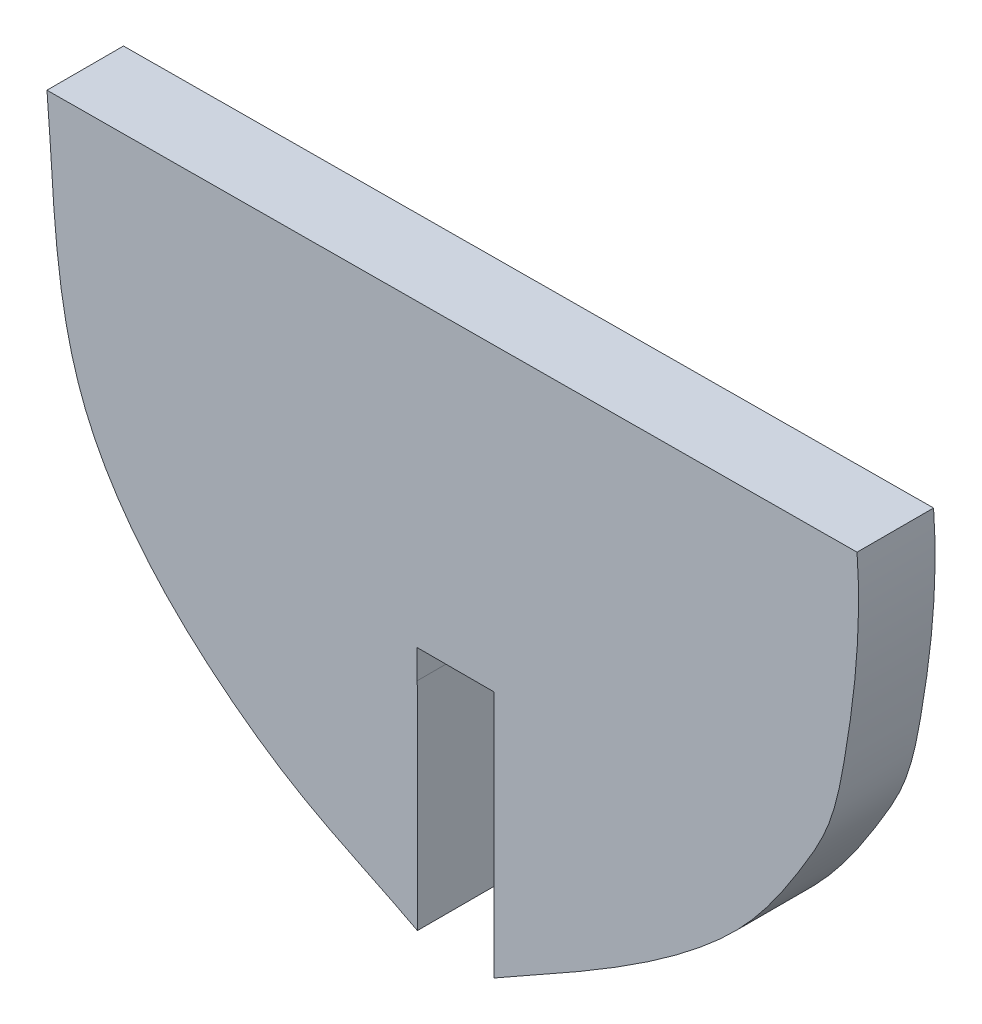
ISO-10303-21;
HEADER;
FILE_DESCRIPTION(('STEP AP214'),'2;1');
FILE_NAME('part.step','',(''),(''),'','','');
FILE_SCHEMA(('AUTOMOTIVE_DESIGN { 1 0 10303 214 1 1 1 1 }'));
ENDSEC;
DATA;
#1=APPLICATION_CONTEXT('core data for automotive mechanical design processes');
#2=APPLICATION_PROTOCOL_DEFINITION('international standard','automotive_design',2000,#1);
#3=PRODUCT_CONTEXT('',#1,'mechanical');
#4=PRODUCT('Part','Part','',(#3));
#5=PRODUCT_RELATED_PRODUCT_CATEGORY('part','',(#4));
#6=PRODUCT_DEFINITION_FORMATION('','',#4);
#7=PRODUCT_DEFINITION_CONTEXT('part definition',#1,'design');
#8=PRODUCT_DEFINITION('design','',#6,#7);
#9=PRODUCT_DEFINITION_SHAPE('','',#8);
#10=(LENGTH_UNIT() NAMED_UNIT(*) SI_UNIT(.MILLI.,.METRE.));
#11=(NAMED_UNIT(*) PLANE_ANGLE_UNIT() SI_UNIT($,.RADIAN.));
#12=(NAMED_UNIT(*) SI_UNIT($,.STERADIAN.) SOLID_ANGLE_UNIT());
#13=UNCERTAINTY_MEASURE_WITH_UNIT(LENGTH_MEASURE(1.E-05),#10,'distance_accuracy_value','');
#14=(GEOMETRIC_REPRESENTATION_CONTEXT(3) GLOBAL_UNCERTAINTY_ASSIGNED_CONTEXT((#13)) GLOBAL_UNIT_ASSIGNED_CONTEXT((#10,
#11,#12)) REPRESENTATION_CONTEXT('',''));
#15=CARTESIAN_POINT('',(0.,0.,0.));
#16=DIRECTION('',(0.,0.,1.));
#17=DIRECTION('',(1.,0.,0.));
#18=AXIS2_PLACEMENT_3D('',#15,#16,#17);
#19=CARTESIAN_POINT('',(9.88414062672051,48.8909674775734,8.));
#20=CARTESIAN_POINT('',(16.7973690641782,52.799383097225,8.));
#21=CARTESIAN_POINT('',(26.48644029243,57.9325721098156,8.));
#22=CARTESIAN_POINT('',(37.0877787236322,67.3102232404793,8.));
#23=CARTESIAN_POINT('',(41.4970740547295,73.9277841349604,8.));
#24=CARTESIAN_POINT('',(45.2673294927324,80.3524661797227,8.));
#25=CARTESIAN_POINT('',(47.3704632870748,91.0399032929968,8.));
#26=CARTESIAN_POINT('',(48.3194732407967,99.8690349474082,8.));
#27=CARTESIAN_POINT('',(47.8336606975591,106.415821200758,8.));
#28=B_SPLINE_CURVE_WITH_KNOTS('',3,(#19,#20,#21,#22,#23,#24,#25,#26,#27),.UNSPECIFIED.,.F.,.F.,
(4,1,1,1,1,1,4),(0.,0.321011787333116,0.439212967345733,0.56589062417626,0.640324830786766,
0.737429993102892,1.),.UNSPECIFIED.);
#29=DIRECTION('',(0.,0.,-1.));
#30=VECTOR('',#29,1.);
#31=SURFACE_OF_LINEAR_EXTRUSION('',#28,#30);
#32=CARTESIAN_POINT('',(9.88414062672051,48.8909674775734,0.));
#33=CARTESIAN_POINT('',(16.7973690641782,52.799383097225,0.));
#34=CARTESIAN_POINT('',(26.48644029243,57.9325721098156,0.));
#35=CARTESIAN_POINT('',(37.0877787236322,67.3102232404793,0.));
#36=CARTESIAN_POINT('',(41.4970740547295,73.9277841349604,0.));
#37=CARTESIAN_POINT('',(45.2673294927324,80.3524661797227,0.));
#38=CARTESIAN_POINT('',(47.3704632870748,91.0399032929968,0.));
#39=CARTESIAN_POINT('',(48.3194732407967,99.8690349474082,0.));
#40=CARTESIAN_POINT('',(47.8336606975591,106.415821200758,0.));
#41=B_SPLINE_CURVE_WITH_KNOTS('',3,(#32,#33,#34,#35,#36,#37,#38,#39,#40),.UNSPECIFIED.,.F.,.F.,
(4,1,1,1,1,1,4),(0.,0.321011787333116,0.439212967345733,0.56589062417626,0.640324830786766,
0.737429993102892,1.),.UNSPECIFIED.);
#42=CARTESIAN_POINT('',(9.88414062672051,48.8909674775734,0.));
#43=VERTEX_POINT('',#42);
#44=CARTESIAN_POINT('',(47.8336606975591,106.415821200758,0.));
#45=VERTEX_POINT('',#44);
#46=EDGE_CURVE('E138',#43,#45,#41,.T.);
#47=ORIENTED_EDGE('',*,*,#46,.T.);
#48=DIRECTION('',(0.,0.,-1.));
#49=VECTOR('',#48,1.);
#50=CARTESIAN_POINT('',(47.8336606975591,106.415821200758,8.));
#51=LINE('',#50,#49);
#52=CARTESIAN_POINT('',(47.8336606975591,106.415821200758,8.));
#53=VERTEX_POINT('',#52);
#54=EDGE_CURVE('E11',#53,#45,#51,.T.);
#55=ORIENTED_EDGE('',*,*,#54,.F.);
#56=CARTESIAN_POINT('',(9.88414062672051,48.8909674775734,8.));
#57=VERTEX_POINT('',#56);
#58=EDGE_CURVE('E162',#57,#53,#28,.T.);
#59=ORIENTED_EDGE('',*,*,#58,.F.);
#60=DIRECTION('',(0.,0.,-1.));
#61=VECTOR('',#60,1.);
#62=CARTESIAN_POINT('',(9.88414062672051,48.8909674775734,8.));
#63=LINE('',#62,#61);
#64=EDGE_CURVE('E134',#57,#43,#63,.T.);
#65=ORIENTED_EDGE('',*,*,#64,.T.);
#66=EDGE_LOOP('',(#47,#55,#59,#65));
#67=FACE_BOUND('',#66,.T.);
#68=ADVANCED_FACE('F41',(#67),#31,.F.);
#69=CARTESIAN_POINT('',(47.8336606975591,106.415821200758,8.));
#70=DIRECTION('',(0.00610299078543812,-0.999981376578321,0.));
#71=DIRECTION('',(0.999981376578321,0.00610299078543812,0.));
#72=AXIS2_PLACEMENT_3D('',#69,#70,#71);
#73=PLANE('',#72);
#74=DIRECTION('',(-0.99998137657832,-0.00610299078543812,0.));
#75=VECTOR('',#74,1.);
#76=CARTESIAN_POINT('',(47.8336606975591,106.415821200758,0.));
#77=LINE('',#76,#75);
#78=CARTESIAN_POINT('',(-36.847635358491,105.899002406295,0.));
#79=VERTEX_POINT('',#78);
#80=EDGE_CURVE('E143',#45,#79,#77,.T.);
#81=ORIENTED_EDGE('',*,*,#80,.T.);
#82=DIRECTION('',(0.,0.,-1.));
#83=VECTOR('',#82,1.);
#84=CARTESIAN_POINT('',(-36.847635358491,105.899002406295,8.));
#85=LINE('',#84,#83);
#86=CARTESIAN_POINT('',(-36.847635358491,105.899002406295,8.));
#87=VERTEX_POINT('',#86);
#88=EDGE_CURVE('E50',#87,#79,#85,.T.);
#89=ORIENTED_EDGE('',*,*,#88,.F.);
#90=DIRECTION('',(-0.99998137657832,-0.00610299078543812,0.));
#91=VECTOR('',#90,1.);
#92=CARTESIAN_POINT('',(47.8336606975591,106.415821200758,8.));
#93=LINE('',#92,#91);
#94=EDGE_CURVE('E101',#53,#87,#93,.T.);
#95=ORIENTED_EDGE('',*,*,#94,.F.);
#96=ORIENTED_EDGE('',*,*,#54,.T.);
#97=EDGE_LOOP('',(#81,#89,#95,#96));
#98=FACE_BOUND('',#97,.T.);
#99=ADVANCED_FACE('F202',(#98),#73,.F.);
#100=CARTESIAN_POINT('',(-36.847635358491,105.899002406295,8.));
#101=CARTESIAN_POINT('',(-36.0664858060786,97.042827625946,8.));
#102=CARTESIAN_POINT('',(-36.3372086802923,82.7405401159872,8.));
#103=CARTESIAN_POINT('',(-26.7565430099379,68.3679408590675,8.));
#104=CARTESIAN_POINT('',(-18.6844662464954,60.9206869290169,8.));
#105=CARTESIAN_POINT('',(-9.36862053910992,54.4058899599076,8.));
#106=CARTESIAN_POINT('',(-2.14754352514569,51.3201035411095,8.));
#107=CARTESIAN_POINT('',(1.88060929933309,49.1820213592139,8.));
#108=B_SPLINE_CURVE_WITH_KNOTS('',3,(#100,#101,#102,#103,#104,#105,#106,#107),.UNSPECIFIED.,.F.,
.F.,(4,1,1,1,1,4),(0.,0.370942891565251,0.541599443098624,0.683371746995421,0.815067179970168,
1.),.UNSPECIFIED.);
#109=DIRECTION('',(0.,0.,-1.));
#110=VECTOR('',#109,1.);
#111=SURFACE_OF_LINEAR_EXTRUSION('',#108,#110);
#112=CARTESIAN_POINT('',(-36.847635358491,105.899002406295,0.));
#113=CARTESIAN_POINT('',(-36.0664858060786,97.042827625946,0.));
#114=CARTESIAN_POINT('',(-36.3372086802923,82.7405401159872,0.));
#115=CARTESIAN_POINT('',(-26.7565430099379,68.3679408590675,0.));
#116=CARTESIAN_POINT('',(-18.6844662464954,60.9206869290169,0.));
#117=CARTESIAN_POINT('',(-9.36862053910992,54.4058899599076,0.));
#118=CARTESIAN_POINT('',(-2.14754352514569,51.3201035411095,0.));
#119=CARTESIAN_POINT('',(1.88060929933309,49.1820213592139,0.));
#120=B_SPLINE_CURVE_WITH_KNOTS('',3,(#112,#113,#114,#115,#116,#117,#118,#119),.UNSPECIFIED.,.F.,
.F.,(4,1,1,1,1,4),(0.,0.370942891565251,0.541599443098624,0.683371746995421,0.815067179970168,
1.),.UNSPECIFIED.);
#121=CARTESIAN_POINT('',(1.88060929933309,49.1820213592139,0.));
#122=VERTEX_POINT('',#121);
#123=EDGE_CURVE('E148',#79,#122,#120,.T.);
#124=ORIENTED_EDGE('',*,*,#123,.T.);
#125=DIRECTION('',(0.,0.,-1.));
#126=VECTOR('',#125,1.);
#127=CARTESIAN_POINT('',(1.88060929933309,49.1820213592139,8.));
#128=LINE('',#127,#126);
#129=CARTESIAN_POINT('',(1.88060929933309,49.1820213592139,8.));
#130=VERTEX_POINT('',#129);
#131=EDGE_CURVE('E169',#130,#122,#128,.T.);
#132=ORIENTED_EDGE('',*,*,#131,.F.);
#133=EDGE_CURVE('E177',#87,#130,#108,.T.);
#134=ORIENTED_EDGE('',*,*,#133,.F.);
#135=ORIENTED_EDGE('',*,*,#88,.T.);
#136=EDGE_LOOP('',(#124,#132,#134,#135));
#137=FACE_BOUND('',#136,.T.);
#138=ADVANCED_FACE('F175',(#137),#111,.F.);
#139=CARTESIAN_POINT('',(1.85934215758753,71.7896389053083,8.));
#140=DIRECTION('',(-0.999999557535561,-0.000940706480558737,0.));
#141=DIRECTION('',(0.000940706480558737,-0.999999557535561,0.));
#142=AXIS2_PLACEMENT_3D('',#139,#140,#141);
#143=PLANE('',#142);
#144=DIRECTION('',(-0.000940706480558737,0.999999557535561,0.));
#145=VECTOR('',#144,1.);
#146=CARTESIAN_POINT('',(1.85934215758753,71.7896389053083,0.));
#147=LINE('',#146,#145);
#148=CARTESIAN_POINT('',(1.85934215758753,71.7896389053083,0.));
#149=VERTEX_POINT('',#148);
#150=EDGE_CURVE('E152',#122,#149,#147,.T.);
#151=ORIENTED_EDGE('',*,*,#150,.T.);
#152=DIRECTION('',(0.,0.,-1.));
#153=VECTOR('',#152,1.);
#154=CARTESIAN_POINT('',(1.85934215758753,71.7896389053083,8.));
#155=LINE('',#154,#153);
#156=CARTESIAN_POINT('',(1.85934215758753,71.7896389053083,8.));
#157=VERTEX_POINT('',#156);
#158=EDGE_CURVE('E166',#157,#149,#155,.T.);
#159=ORIENTED_EDGE('',*,*,#158,.F.);
#160=DIRECTION('',(-0.000940706480558737,0.999999557535561,0.));
#161=VECTOR('',#160,1.);
#162=CARTESIAN_POINT('',(1.85934215758753,71.7896389053083,8.));
#163=LINE('',#162,#161);
#164=EDGE_CURVE('E189',#130,#157,#163,.T.);
#165=ORIENTED_EDGE('',*,*,#164,.F.);
#166=ORIENTED_EDGE('',*,*,#131,.T.);
#167=EDGE_LOOP('',(#151,#159,#165,#166));
#168=FACE_BOUND('',#167,.T.);
#169=ADVANCED_FACE('F185',(#168),#143,.F.);
#170=CARTESIAN_POINT('',(1.85934215758753,71.7896389053083,8.));
#171=DIRECTION('',(-1.,0.,0.));
#172=DIRECTION('',(0.,0.,1.));
#173=AXIS2_PLACEMENT_3D('',#170,#171,#172);
#174=PLANE('',#173);
#175=DIRECTION('',(0.,1.,0.));
#176=VECTOR('',#175,1.);
#177=CARTESIAN_POINT('',(1.85934215758753,71.7896389053083,0.));
#178=LINE('',#177,#176);
#179=CARTESIAN_POINT('',(1.85934215758753,74.7896389053083,0.));
#180=VERTEX_POINT('',#179);
#181=EDGE_CURVE('E157',#149,#180,#178,.T.);
#182=ORIENTED_EDGE('',*,*,#181,.T.);
#183=DIRECTION('',(0.,0.,-1.));
#184=VECTOR('',#183,1.);
#185=CARTESIAN_POINT('',(1.85934215758753,74.7896389053083,8.));
#186=LINE('',#185,#184);
#187=CARTESIAN_POINT('',(1.85934215758753,74.7896389053083,8.));
#188=VERTEX_POINT('',#187);
#189=EDGE_CURVE('E129',#188,#180,#186,.T.);
#190=ORIENTED_EDGE('',*,*,#189,.F.);
#191=DIRECTION('',(0.,1.,0.));
#192=VECTOR('',#191,1.);
#193=CARTESIAN_POINT('',(1.85934215758753,71.7896389053083,8.));
#194=LINE('',#193,#192);
#195=EDGE_CURVE('E120',#157,#188,#194,.T.);
#196=ORIENTED_EDGE('',*,*,#195,.F.);
#197=ORIENTED_EDGE('',*,*,#158,.T.);
#198=EDGE_LOOP('',(#182,#190,#196,#197));
#199=FACE_BOUND('',#198,.T.);
#200=ADVANCED_FACE('F188',(#199),#174,.F.);
#201=CARTESIAN_POINT('',(9.86259260626901,74.7896389053083,8.));
#202=DIRECTION('',(0.,1.,0.));
#203=DIRECTION('',(0.,0.,1.));
#204=AXIS2_PLACEMENT_3D('',#201,#202,#203);
#205=PLANE('',#204);
#206=DIRECTION('',(1.,0.,0.));
#207=VECTOR('',#206,1.);
#208=CARTESIAN_POINT('',(9.86259260626901,74.7896389053083,0.));
#209=LINE('',#208,#207);
#210=CARTESIAN_POINT('',(9.86259260626901,74.7896389053083,0.));
#211=VERTEX_POINT('',#210);
#212=EDGE_CURVE('E128',#180,#211,#209,.T.);
#213=ORIENTED_EDGE('',*,*,#212,.T.);
#214=DIRECTION('',(0.,0.,-1.));
#215=VECTOR('',#214,1.);
#216=CARTESIAN_POINT('',(9.86259260626901,74.7896389053083,8.));
#217=LINE('',#216,#215);
#218=CARTESIAN_POINT('',(9.86259260626901,74.7896389053083,8.));
#219=VERTEX_POINT('',#218);
#220=EDGE_CURVE('E125',#219,#211,#217,.T.);
#221=ORIENTED_EDGE('',*,*,#220,.F.);
#222=DIRECTION('',(1.,0.,0.));
#223=VECTOR('',#222,1.);
#224=CARTESIAN_POINT('',(9.86259260626901,74.7896389053083,8.));
#225=LINE('',#224,#223);
#226=EDGE_CURVE('E114',#188,#219,#225,.T.);
#227=ORIENTED_EDGE('',*,*,#226,.F.);
#228=ORIENTED_EDGE('',*,*,#189,.T.);
#229=EDGE_LOOP('',(#213,#221,#227,#228));
#230=FACE_BOUND('',#229,.T.);
#231=ADVANCED_FACE('F126',(#230),#205,.F.);
#232=CARTESIAN_POINT('',(9.86259260626901,71.7971676182021,8.));
#233=DIRECTION('',(1.,0.,0.));
#234=DIRECTION('',(0.,0.,-1.));
#235=AXIS2_PLACEMENT_3D('',#232,#233,#234);
#236=PLANE('',#235);
#237=DIRECTION('',(0.,-1.,0.));
#238=VECTOR('',#237,1.);
#239=CARTESIAN_POINT('',(9.86259260626901,71.7971676182021,0.));
#240=LINE('',#239,#238);
#241=CARTESIAN_POINT('',(9.86259260626901,71.7971676182021,0.));
#242=VERTEX_POINT('',#241);
#243=EDGE_CURVE('E87',#211,#242,#240,.T.);
#244=ORIENTED_EDGE('',*,*,#243,.T.);
#245=DIRECTION('',(0.,0.,-1.));
#246=VECTOR('',#245,1.);
#247=CARTESIAN_POINT('',(9.86259260626901,71.7971676182021,8.));
#248=LINE('',#247,#246);
#249=CARTESIAN_POINT('',(9.86259260626901,71.7971676182021,8.));
#250=VERTEX_POINT('',#249);
#251=EDGE_CURVE('E130',#250,#242,#248,.T.);
#252=ORIENTED_EDGE('',*,*,#251,.F.);
#253=DIRECTION('',(0.,-1.,0.));
#254=VECTOR('',#253,1.);
#255=CARTESIAN_POINT('',(9.86259260626901,71.7971676182021,8.));
#256=LINE('',#255,#254);
#257=EDGE_CURVE('E118',#219,#250,#256,.T.);
#258=ORIENTED_EDGE('',*,*,#257,.F.);
#259=ORIENTED_EDGE('',*,*,#220,.T.);
#260=EDGE_LOOP('',(#244,#252,#258,#259));
#261=FACE_BOUND('',#260,.T.);
#262=ADVANCED_FACE('F132',(#261),#236,.F.);
#263=CARTESIAN_POINT('',(9.88414062672051,48.8909674775734,8.));
#264=DIRECTION('',(0.999999557535561,0.000940706480558823,0.));
#265=DIRECTION('',(-0.000940706480558823,0.999999557535561,0.));
#266=AXIS2_PLACEMENT_3D('',#263,#264,#265);
#267=PLANE('',#266);
#268=DIRECTION('',(0.000940706480558823,-0.999999557535561,0.));
#269=VECTOR('',#268,1.);
#270=CARTESIAN_POINT('',(9.88414062672051,48.8909674775734,0.));
#271=LINE('',#270,#269);
#272=EDGE_CURVE('E93',#242,#43,#271,.T.);
#273=ORIENTED_EDGE('',*,*,#272,.T.);
#274=ORIENTED_EDGE('',*,*,#64,.F.);
#275=DIRECTION('',(0.000940706480558823,-0.999999557535561,0.));
#276=VECTOR('',#275,1.);
#277=CARTESIAN_POINT('',(9.88414062672051,48.8909674775734,8.));
#278=LINE('',#277,#276);
#279=EDGE_CURVE('E58',#250,#57,#278,.T.);
#280=ORIENTED_EDGE('',*,*,#279,.F.);
#281=ORIENTED_EDGE('',*,*,#251,.T.);
#282=EDGE_LOOP('',(#273,#274,#280,#281));
#283=FACE_BOUND('',#282,.T.);
#284=ADVANCED_FACE('F211',(#283),#267,.F.);
#285=CARTESIAN_POINT('',(39.4331978088349,70.9593925452252,8.));
#286=DIRECTION('',(0.,0.,1.));
#287=DIRECTION('',(1.,0.,0.));
#288=AXIS2_PLACEMENT_3D('',#285,#286,#287);
#289=PLANE('',#288);
#290=ORIENTED_EDGE('',*,*,#58,.T.);
#291=ORIENTED_EDGE('',*,*,#94,.T.);
#292=ORIENTED_EDGE('',*,*,#133,.T.);
#293=ORIENTED_EDGE('',*,*,#164,.T.);
#294=ORIENTED_EDGE('',*,*,#195,.T.);
#295=ORIENTED_EDGE('',*,*,#226,.T.);
#296=ORIENTED_EDGE('',*,*,#257,.T.);
#297=ORIENTED_EDGE('',*,*,#279,.T.);
#298=EDGE_LOOP('',(#290,#291,#292,#293,#294,#295,#296,#297));
#299=FACE_BOUND('',#298,.T.);
#300=ADVANCED_FACE('F116',(#299),#289,.T.);
#301=CARTESIAN_POINT('',(39.4331978088349,70.9593925452252,0.));
#302=DIRECTION('',(0.,0.,1.));
#303=DIRECTION('',(1.,0.,0.));
#304=AXIS2_PLACEMENT_3D('',#301,#302,#303);
#305=PLANE('',#304);
#306=ORIENTED_EDGE('',*,*,#46,.F.);
#307=ORIENTED_EDGE('',*,*,#272,.F.);
#308=ORIENTED_EDGE('',*,*,#243,.F.);
#309=ORIENTED_EDGE('',*,*,#212,.F.);
#310=ORIENTED_EDGE('',*,*,#181,.F.);
#311=ORIENTED_EDGE('',*,*,#150,.F.);
#312=ORIENTED_EDGE('',*,*,#123,.F.);
#313=ORIENTED_EDGE('',*,*,#80,.F.);
#314=EDGE_LOOP('',(#306,#307,#308,#309,#310,#311,#312,#313));
#315=FACE_BOUND('',#314,.T.);
#316=ADVANCED_FACE('F181',(#315),#305,.F.);
#317=CLOSED_SHELL('',(#68,#99,#138,#169,#200,#231,#262,#284,#300,#316));
#318=MANIFOLD_SOLID_BREP('B2',#317);
#319=ADVANCED_BREP_SHAPE_REPRESENTATION('',(#18,#318),#14);
#320=SHAPE_DEFINITION_REPRESENTATION(#9,#319);
ENDSEC;
END-ISO-10303-21;
